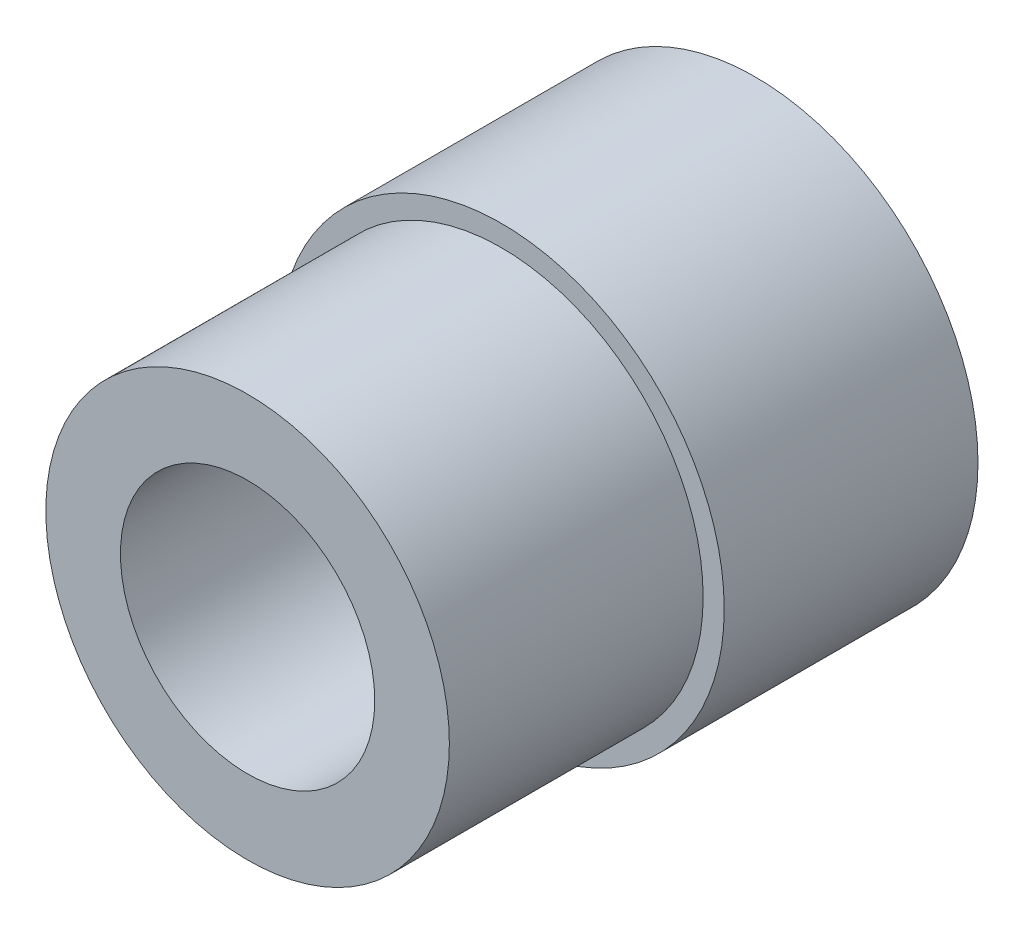
ISO-10303-21;
HEADER;
FILE_DESCRIPTION(('STEP AP214'),'2;1');
FILE_NAME('part.step','',(''),(''),'','','');
FILE_SCHEMA(('AUTOMOTIVE_DESIGN { 1 0 10303 214 1 1 1 1 }'));
ENDSEC;
DATA;
#1=APPLICATION_CONTEXT('core data for automotive mechanical design processes');
#2=APPLICATION_PROTOCOL_DEFINITION('international standard','automotive_design',2000,#1);
#3=PRODUCT_CONTEXT('',#1,'mechanical');
#4=PRODUCT('Part','Part','',(#3));
#5=PRODUCT_RELATED_PRODUCT_CATEGORY('part','',(#4));
#6=PRODUCT_DEFINITION_FORMATION('','',#4);
#7=PRODUCT_DEFINITION_CONTEXT('part definition',#1,'design');
#8=PRODUCT_DEFINITION('design','',#6,#7);
#9=PRODUCT_DEFINITION_SHAPE('','',#8);
#10=(LENGTH_UNIT() NAMED_UNIT(*) SI_UNIT(.MILLI.,.METRE.));
#11=(NAMED_UNIT(*) PLANE_ANGLE_UNIT() SI_UNIT($,.RADIAN.));
#12=(NAMED_UNIT(*) SI_UNIT($,.STERADIAN.) SOLID_ANGLE_UNIT());
#13=UNCERTAINTY_MEASURE_WITH_UNIT(LENGTH_MEASURE(1.E-05),#10,'distance_accuracy_value','');
#14=(GEOMETRIC_REPRESENTATION_CONTEXT(3) GLOBAL_UNCERTAINTY_ASSIGNED_CONTEXT((#13)) GLOBAL_UNIT_ASSIGNED_CONTEXT((#10,
#11,#12)) REPRESENTATION_CONTEXT('',''));
#15=CARTESIAN_POINT('',(0.,0.,0.));
#16=DIRECTION('',(0.,0.,1.));
#17=DIRECTION('',(1.,0.,0.));
#18=AXIS2_PLACEMENT_3D('',#15,#16,#17);
#19=CARTESIAN_POINT('',(0.,0.,12.7));
#20=DIRECTION('',(0.,0.,1.));
#21=DIRECTION('',(1.,0.,0.));
#22=AXIS2_PLACEMENT_3D('',#19,#20,#21);
#23=PLANE('',#22);
#24=CARTESIAN_POINT('',(0.,0.,12.7));
#25=DIRECTION('',(0.,0.,1.));
#26=DIRECTION('',(1.,0.,0.));
#27=AXIS2_PLACEMENT_3D('',#24,#25,#26);
#28=CIRCLE('',#27,6.3627);
#29=CARTESIAN_POINT('',(6.3627,0.,12.7));
#30=VERTEX_POINT('',#29);
#31=EDGE_CURVE('E38',#30,#30,#28,.T.);
#32=ORIENTED_EDGE('',*,*,#31,.F.);
#33=EDGE_LOOP('',(#32));
#34=FACE_BOUND('',#33,.T.);
#35=CARTESIAN_POINT('',(0.,0.,12.7));
#36=DIRECTION('',(0.,0.,1.));
#37=DIRECTION('',(1.,0.,0.));
#38=AXIS2_PLACEMENT_3D('',#35,#36,#37);
#39=CIRCLE('',#38,10.0965);
#40=CARTESIAN_POINT('',(10.0965,0.,12.7));
#41=VERTEX_POINT('',#40);
#42=EDGE_CURVE('E49',#41,#41,#39,.T.);
#43=ORIENTED_EDGE('',*,*,#42,.T.);
#44=EDGE_LOOP('',(#43));
#45=FACE_BOUND('',#44,.T.);
#46=ADVANCED_FACE('F31',(#34,#45),#23,.T.);
#47=CARTESIAN_POINT('',(0.,0.,12.7));
#48=DIRECTION('',(0.,0.,-1.));
#49=DIRECTION('',(-1.,0.,0.));
#50=AXIS2_PLACEMENT_3D('',#47,#48,#49);
#51=CYLINDRICAL_SURFACE('',#50,11.1506);
#52=CARTESIAN_POINT('',(0.,0.,-12.7));
#53=DIRECTION('',(0.,0.,1.));
#54=DIRECTION('',(1.,0.,0.));
#55=AXIS2_PLACEMENT_3D('',#52,#53,#54);
#56=CIRCLE('',#55,11.1506);
#57=CARTESIAN_POINT('',(11.1506,0.,-12.7));
#58=VERTEX_POINT('',#57);
#59=EDGE_CURVE('E10',#58,#58,#56,.T.);
#60=ORIENTED_EDGE('',*,*,#59,.T.);
#61=EDGE_LOOP('',(#60));
#62=FACE_BOUND('',#61,.T.);
#63=CARTESIAN_POINT('',(0.,0.,0.));
#64=DIRECTION('',(0.,0.,1.));
#65=DIRECTION('',(1.,0.,0.));
#66=AXIS2_PLACEMENT_3D('',#63,#64,#65);
#67=CIRCLE('',#66,11.1506);
#68=CARTESIAN_POINT('',(11.1506,0.,0.));
#69=VERTEX_POINT('',#68);
#70=EDGE_CURVE('E47',#69,#69,#67,.T.);
#71=ORIENTED_EDGE('',*,*,#70,.F.);
#72=EDGE_LOOP('',(#71));
#73=FACE_BOUND('',#72,.T.);
#74=ADVANCED_FACE('F33',(#62,#73),#51,.T.);
#75=CARTESIAN_POINT('',(0.,0.,-12.7));
#76=DIRECTION('',(0.,0.,1.));
#77=DIRECTION('',(1.,0.,0.));
#78=AXIS2_PLACEMENT_3D('',#75,#76,#77);
#79=PLANE('',#78);
#80=ORIENTED_EDGE('',*,*,#59,.F.);
#81=EDGE_LOOP('',(#80));
#82=FACE_BOUND('',#81,.T.);
#83=CARTESIAN_POINT('',(0.,0.,-12.7));
#84=DIRECTION('',(0.,0.,1.));
#85=DIRECTION('',(1.,0.,0.));
#86=AXIS2_PLACEMENT_3D('',#83,#84,#85);
#87=CIRCLE('',#86,6.3627);
#88=CARTESIAN_POINT('',(6.3627,0.,-12.7));
#89=VERTEX_POINT('',#88);
#90=EDGE_CURVE('E42',#89,#89,#87,.T.);
#91=ORIENTED_EDGE('',*,*,#90,.T.);
#92=EDGE_LOOP('',(#91));
#93=FACE_BOUND('',#92,.T.);
#94=ADVANCED_FACE('F68',(#82,#93),#79,.F.);
#95=CARTESIAN_POINT('',(0.,0.,12.7));
#96=DIRECTION('',(0.,0.,-1.));
#97=DIRECTION('',(-1.,0.,0.));
#98=AXIS2_PLACEMENT_3D('',#95,#96,#97);
#99=CYLINDRICAL_SURFACE('',#98,6.3627);
#100=ORIENTED_EDGE('',*,*,#31,.T.);
#101=EDGE_LOOP('',(#100));
#102=FACE_BOUND('',#101,.T.);
#103=ORIENTED_EDGE('',*,*,#90,.F.);
#104=EDGE_LOOP('',(#103));
#105=FACE_BOUND('',#104,.T.);
#106=ADVANCED_FACE('F74',(#102,#105),#99,.F.);
#107=CARTESIAN_POINT('',(0.,0.,0.));
#108=DIRECTION('',(0.,0.,1.));
#109=DIRECTION('',(1.,0.,0.));
#110=AXIS2_PLACEMENT_3D('',#107,#108,#109);
#111=CYLINDRICAL_SURFACE('',#110,10.0965);
#112=CARTESIAN_POINT('',(0.,0.,0.));
#113=DIRECTION('',(0.,0.,1.));
#114=DIRECTION('',(1.,0.,0.));
#115=AXIS2_PLACEMENT_3D('',#112,#113,#114);
#116=CIRCLE('',#115,10.0965);
#117=CARTESIAN_POINT('',(10.0965,0.,0.));
#118=VERTEX_POINT('',#117);
#119=EDGE_CURVE('E52',#118,#118,#116,.T.);
#120=ORIENTED_EDGE('',*,*,#119,.T.);
#121=EDGE_LOOP('',(#120));
#122=FACE_BOUND('',#121,.T.);
#123=ORIENTED_EDGE('',*,*,#42,.F.);
#124=EDGE_LOOP('',(#123));
#125=FACE_BOUND('',#124,.T.);
#126=ADVANCED_FACE('F58',(#122,#125),#111,.T.);
#127=CARTESIAN_POINT('',(0.,0.,0.));
#128=DIRECTION('',(0.,0.,1.));
#129=DIRECTION('',(1.,0.,0.));
#130=AXIS2_PLACEMENT_3D('',#127,#128,#129);
#131=PLANE('',#130);
#132=ORIENTED_EDGE('',*,*,#119,.F.);
#133=EDGE_LOOP('',(#132));
#134=FACE_BOUND('',#133,.T.);
#135=ORIENTED_EDGE('',*,*,#70,.T.);
#136=EDGE_LOOP('',(#135));
#137=FACE_BOUND('',#136,.T.);
#138=ADVANCED_FACE('F61',(#134,#137),#131,.T.);
#139=CLOSED_SHELL('',(#46,#74,#94,#106,#126,#138));
#140=MANIFOLD_SOLID_BREP('B2',#139);
#141=ADVANCED_BREP_SHAPE_REPRESENTATION('',(#18,#140),#14);
#142=SHAPE_DEFINITION_REPRESENTATION(#9,#141);
ENDSEC;
END-ISO-10303-21;
